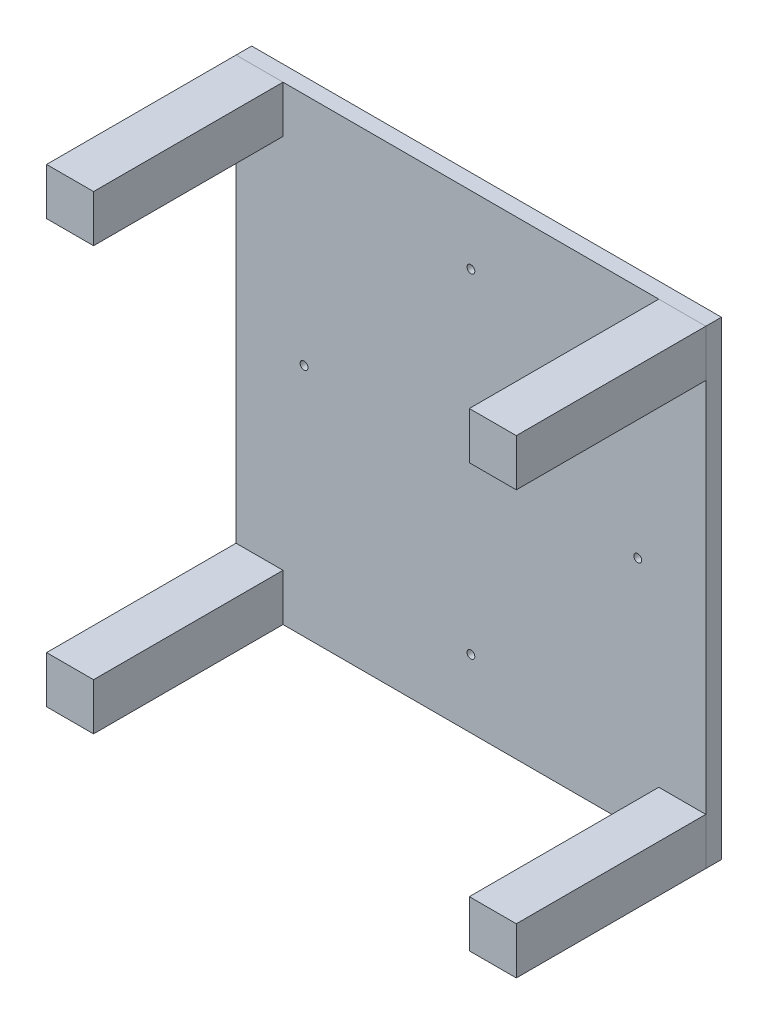
ISO-10303-21;
HEADER;
FILE_DESCRIPTION(('STEP AP214'),'2;1');
FILE_NAME('part.step','',(''),(''),'','','');
FILE_SCHEMA(('AUTOMOTIVE_DESIGN { 1 0 10303 214 1 1 1 1 }'));
ENDSEC;
DATA;
#1=APPLICATION_CONTEXT('core data for automotive mechanical design processes');
#2=APPLICATION_PROTOCOL_DEFINITION('international standard','automotive_design',2000,#1);
#3=PRODUCT_CONTEXT('',#1,'mechanical');
#4=PRODUCT('Part','Part','',(#3));
#5=PRODUCT_RELATED_PRODUCT_CATEGORY('part','',(#4));
#6=PRODUCT_DEFINITION_FORMATION('','',#4);
#7=PRODUCT_DEFINITION_CONTEXT('part definition',#1,'design');
#8=PRODUCT_DEFINITION('design','',#6,#7);
#9=PRODUCT_DEFINITION_SHAPE('','',#8);
#10=(LENGTH_UNIT() NAMED_UNIT(*) SI_UNIT(.MILLI.,.METRE.));
#11=(NAMED_UNIT(*) PLANE_ANGLE_UNIT() SI_UNIT($,.RADIAN.));
#12=(NAMED_UNIT(*) SI_UNIT($,.STERADIAN.) SOLID_ANGLE_UNIT());
#13=UNCERTAINTY_MEASURE_WITH_UNIT(LENGTH_MEASURE(1.E-05),#10,'distance_accuracy_value','');
#14=(GEOMETRIC_REPRESENTATION_CONTEXT(3) GLOBAL_UNCERTAINTY_ASSIGNED_CONTEXT((#13)) GLOBAL_UNIT_ASSIGNED_CONTEXT((#10,
#11,#12)) REPRESENTATION_CONTEXT('',''));
#15=CARTESIAN_POINT('',(0.,0.,0.));
#16=DIRECTION('',(0.,0.,1.));
#17=DIRECTION('',(1.,0.,0.));
#18=AXIS2_PLACEMENT_3D('',#15,#16,#17);
#19=CARTESIAN_POINT('',(150.,-150.,131.));
#20=DIRECTION('',(-1.,0.,0.));
#21=DIRECTION('',(0.,0.,1.));
#22=AXIS2_PLACEMENT_3D('',#19,#20,#21);
#23=PLANE('',#22);
#24=DIRECTION('',(0.,1.,0.));
#25=VECTOR('',#24,1.);
#26=CARTESIAN_POINT('',(150.,-150.,10.));
#27=LINE('',#26,#25);
#28=CARTESIAN_POINT('',(150.,-150.,10.));
#29=VERTEX_POINT('',#28);
#30=CARTESIAN_POINT('',(150.,-120.,10.));
#31=VERTEX_POINT('',#30);
#32=EDGE_CURVE('E109',#29,#31,#27,.T.);
#33=ORIENTED_EDGE('',*,*,#32,.T.);
#34=DIRECTION('',(0.,0.,-1.));
#35=VECTOR('',#34,1.);
#36=CARTESIAN_POINT('',(150.,-120.,131.));
#37=LINE('',#36,#35);
#38=CARTESIAN_POINT('',(150.,-120.,131.));
#39=VERTEX_POINT('',#38);
#40=EDGE_CURVE('E12',#39,#31,#37,.T.);
#41=ORIENTED_EDGE('',*,*,#40,.F.);
#42=DIRECTION('',(0.,1.,0.));
#43=VECTOR('',#42,1.);
#44=CARTESIAN_POINT('',(150.,-150.,131.));
#45=LINE('',#44,#43);
#46=CARTESIAN_POINT('',(150.,-150.,131.));
#47=VERTEX_POINT('',#46);
#48=EDGE_CURVE('E97',#47,#39,#45,.T.);
#49=ORIENTED_EDGE('',*,*,#48,.F.);
#50=DIRECTION('',(0.,0.,-1.));
#51=VECTOR('',#50,1.);
#52=CARTESIAN_POINT('',(150.,-150.,131.));
#53=LINE('',#52,#51);
#54=EDGE_CURVE('E105',#47,#29,#53,.T.);
#55=ORIENTED_EDGE('',*,*,#54,.T.);
#56=EDGE_LOOP('',(#33,#41,#49,#55));
#57=FACE_BOUND('',#56,.T.);
#58=ADVANCED_FACE('F46',(#57),#23,.F.);
#59=CARTESIAN_POINT('',(150.,-120.,131.));
#60=DIRECTION('',(0.,-1.,0.));
#61=DIRECTION('',(0.,0.,-1.));
#62=AXIS2_PLACEMENT_3D('',#59,#60,#61);
#63=PLANE('',#62);
#64=DIRECTION('',(-1.,0.,0.));
#65=VECTOR('',#64,1.);
#66=CARTESIAN_POINT('',(150.,-120.,10.));
#67=LINE('',#66,#65);
#68=CARTESIAN_POINT('',(120.,-120.,10.));
#69=VERTEX_POINT('',#68);
#70=EDGE_CURVE('E101',#31,#69,#67,.T.);
#71=ORIENTED_EDGE('',*,*,#70,.T.);
#72=DIRECTION('',(0.,0.,-1.));
#73=VECTOR('',#72,1.);
#74=CARTESIAN_POINT('',(120.,-120.,131.));
#75=LINE('',#74,#73);
#76=CARTESIAN_POINT('',(120.,-120.,131.));
#77=VERTEX_POINT('',#76);
#78=EDGE_CURVE('E54',#77,#69,#75,.T.);
#79=ORIENTED_EDGE('',*,*,#78,.F.);
#80=DIRECTION('',(-1.,0.,0.));
#81=VECTOR('',#80,1.);
#82=CARTESIAN_POINT('',(150.,-120.,131.));
#83=LINE('',#82,#81);
#84=EDGE_CURVE('E92',#39,#77,#83,.T.);
#85=ORIENTED_EDGE('',*,*,#84,.F.);
#86=ORIENTED_EDGE('',*,*,#40,.T.);
#87=EDGE_LOOP('',(#71,#79,#85,#86));
#88=FACE_BOUND('',#87,.T.);
#89=ADVANCED_FACE('F100',(#88),#63,.F.);
#90=CARTESIAN_POINT('',(120.,-150.,131.));
#91=DIRECTION('',(1.,0.,0.));
#92=DIRECTION('',(0.,0.,-1.));
#93=AXIS2_PLACEMENT_3D('',#90,#91,#92);
#94=PLANE('',#93);
#95=DIRECTION('',(0.,-1.,0.));
#96=VECTOR('',#95,1.);
#97=CARTESIAN_POINT('',(120.,-150.,10.));
#98=LINE('',#97,#96);
#99=CARTESIAN_POINT('',(120.,-150.,10.));
#100=VERTEX_POINT('',#99);
#101=EDGE_CURVE('E79',#69,#100,#98,.T.);
#102=ORIENTED_EDGE('',*,*,#101,.T.);
#103=DIRECTION('',(0.,0.,-1.));
#104=VECTOR('',#103,1.);
#105=CARTESIAN_POINT('',(120.,-150.,131.));
#106=LINE('',#105,#104);
#107=CARTESIAN_POINT('',(120.,-150.,131.));
#108=VERTEX_POINT('',#107);
#109=EDGE_CURVE('E102',#108,#100,#106,.T.);
#110=ORIENTED_EDGE('',*,*,#109,.F.);
#111=DIRECTION('',(0.,-1.,0.));
#112=VECTOR('',#111,1.);
#113=CARTESIAN_POINT('',(120.,-150.,131.));
#114=LINE('',#113,#112);
#115=EDGE_CURVE('E95',#77,#108,#114,.T.);
#116=ORIENTED_EDGE('',*,*,#115,.F.);
#117=ORIENTED_EDGE('',*,*,#78,.T.);
#118=EDGE_LOOP('',(#102,#110,#116,#117));
#119=FACE_BOUND('',#118,.T.);
#120=ADVANCED_FACE('F103',(#119),#94,.F.);
#121=CARTESIAN_POINT('',(150.,-150.,131.));
#122=DIRECTION('',(0.,1.,0.));
#123=DIRECTION('',(0.,0.,1.));
#124=AXIS2_PLACEMENT_3D('',#121,#122,#123);
#125=PLANE('',#124);
#126=DIRECTION('',(1.,0.,0.));
#127=VECTOR('',#126,1.);
#128=CARTESIAN_POINT('',(150.,-150.,10.));
#129=LINE('',#128,#127);
#130=EDGE_CURVE('E85',#100,#29,#129,.T.);
#131=ORIENTED_EDGE('',*,*,#130,.T.);
#132=ORIENTED_EDGE('',*,*,#54,.F.);
#133=DIRECTION('',(1.,0.,0.));
#134=VECTOR('',#133,1.);
#135=CARTESIAN_POINT('',(150.,-150.,131.));
#136=LINE('',#135,#134);
#137=EDGE_CURVE('E62',#108,#47,#136,.T.);
#138=ORIENTED_EDGE('',*,*,#137,.F.);
#139=ORIENTED_EDGE('',*,*,#109,.T.);
#140=EDGE_LOOP('',(#131,#132,#138,#139));
#141=FACE_BOUND('',#140,.T.);
#142=ADVANCED_FACE('F116',(#141),#125,.F.);
#143=CARTESIAN_POINT('',(0.,0.,131.));
#144=DIRECTION('',(0.,0.,1.));
#145=DIRECTION('',(1.,0.,0.));
#146=AXIS2_PLACEMENT_3D('',#143,#144,#145);
#147=PLANE('',#146);
#148=ORIENTED_EDGE('',*,*,#48,.T.);
#149=ORIENTED_EDGE('',*,*,#84,.T.);
#150=ORIENTED_EDGE('',*,*,#115,.T.);
#151=ORIENTED_EDGE('',*,*,#137,.T.);
#152=EDGE_LOOP('',(#148,#149,#150,#151));
#153=FACE_BOUND('',#152,.T.);
#154=ADVANCED_FACE('F93',(#153),#147,.T.);
#155=CARTESIAN_POINT('',(0.,0.,10.));
#156=DIRECTION('',(0.,0.,1.));
#157=DIRECTION('',(1.,0.,0.));
#158=AXIS2_PLACEMENT_3D('',#155,#156,#157);
#159=PLANE('',#158);
#160=ORIENTED_EDGE('',*,*,#32,.F.);
#161=ORIENTED_EDGE('',*,*,#130,.F.);
#162=ORIENTED_EDGE('',*,*,#101,.F.);
#163=ORIENTED_EDGE('',*,*,#70,.F.);
#164=EDGE_LOOP('',(#160,#161,#162,#163));
#165=FACE_BOUND('',#164,.T.);
#166=ADVANCED_FACE('F119',(#165),#159,.F.);
#167=CLOSED_SHELL('',(#58,#89,#120,#142,#154,#166));
#168=MANIFOLD_SOLID_BREP('B2',#167);
#169=CARTESIAN_POINT('',(-150.,-150.,131.));
#170=DIRECTION('',(0.,1.,0.));
#171=DIRECTION('',(0.,0.,1.));
#172=AXIS2_PLACEMENT_3D('',#169,#170,#171);
#173=PLANE('',#172);
#174=DIRECTION('',(1.,0.,0.));
#175=VECTOR('',#174,1.);
#176=CARTESIAN_POINT('',(-150.,-150.,10.));
#177=LINE('',#176,#175);
#178=CARTESIAN_POINT('',(-150.,-150.,10.));
#179=VERTEX_POINT('',#178);
#180=CARTESIAN_POINT('',(-120.,-150.,10.));
#181=VERTEX_POINT('',#180);
#182=EDGE_CURVE('E243',#179,#181,#177,.T.);
#183=ORIENTED_EDGE('',*,*,#182,.T.);
#184=DIRECTION('',(0.,0.,-1.));
#185=VECTOR('',#184,1.);
#186=CARTESIAN_POINT('',(-120.,-150.,131.));
#187=LINE('',#186,#185);
#188=CARTESIAN_POINT('',(-120.,-150.,131.));
#189=VERTEX_POINT('',#188);
#190=EDGE_CURVE('E44',#189,#181,#187,.T.);
#191=ORIENTED_EDGE('',*,*,#190,.F.);
#192=DIRECTION('',(1.,0.,0.));
#193=VECTOR('',#192,1.);
#194=CARTESIAN_POINT('',(-150.,-150.,131.));
#195=LINE('',#194,#193);
#196=CARTESIAN_POINT('',(-150.,-150.,131.));
#197=VERTEX_POINT('',#196);
#198=EDGE_CURVE('E231',#197,#189,#195,.T.);
#199=ORIENTED_EDGE('',*,*,#198,.F.);
#200=DIRECTION('',(0.,0.,-1.));
#201=VECTOR('',#200,1.);
#202=CARTESIAN_POINT('',(-150.,-150.,131.));
#203=LINE('',#202,#201);
#204=EDGE_CURVE('E239',#197,#179,#203,.T.);
#205=ORIENTED_EDGE('',*,*,#204,.T.);
#206=EDGE_LOOP('',(#183,#191,#199,#205));
#207=FACE_BOUND('',#206,.T.);
#208=ADVANCED_FACE('F180',(#207),#173,.F.);
#209=CARTESIAN_POINT('',(-120.,-150.,131.));
#210=DIRECTION('',(-1.,0.,0.));
#211=DIRECTION('',(0.,0.,1.));
#212=AXIS2_PLACEMENT_3D('',#209,#210,#211);
#213=PLANE('',#212);
#214=DIRECTION('',(0.,1.,0.));
#215=VECTOR('',#214,1.);
#216=CARTESIAN_POINT('',(-120.,-150.,10.));
#217=LINE('',#216,#215);
#218=CARTESIAN_POINT('',(-120.,-120.,10.));
#219=VERTEX_POINT('',#218);
#220=EDGE_CURVE('E235',#181,#219,#217,.T.);
#221=ORIENTED_EDGE('',*,*,#220,.T.);
#222=DIRECTION('',(0.,0.,-1.));
#223=VECTOR('',#222,1.);
#224=CARTESIAN_POINT('',(-120.,-120.,131.));
#225=LINE('',#224,#223);
#226=CARTESIAN_POINT('',(-120.,-120.,131.));
#227=VERTEX_POINT('',#226);
#228=EDGE_CURVE('E188',#227,#219,#225,.T.);
#229=ORIENTED_EDGE('',*,*,#228,.F.);
#230=DIRECTION('',(0.,1.,0.));
#231=VECTOR('',#230,1.);
#232=CARTESIAN_POINT('',(-120.,-150.,131.));
#233=LINE('',#232,#231);
#234=EDGE_CURVE('E226',#189,#227,#233,.T.);
#235=ORIENTED_EDGE('',*,*,#234,.F.);
#236=ORIENTED_EDGE('',*,*,#190,.T.);
#237=EDGE_LOOP('',(#221,#229,#235,#236));
#238=FACE_BOUND('',#237,.T.);
#239=ADVANCED_FACE('F234',(#238),#213,.F.);
#240=CARTESIAN_POINT('',(-150.,-120.,131.));
#241=DIRECTION('',(0.,-1.,0.));
#242=DIRECTION('',(0.,0.,-1.));
#243=AXIS2_PLACEMENT_3D('',#240,#241,#242);
#244=PLANE('',#243);
#245=DIRECTION('',(-1.,0.,0.));
#246=VECTOR('',#245,1.);
#247=CARTESIAN_POINT('',(-150.,-120.,10.));
#248=LINE('',#247,#246);
#249=CARTESIAN_POINT('',(-150.,-120.,10.));
#250=VERTEX_POINT('',#249);
#251=EDGE_CURVE('E213',#219,#250,#248,.T.);
#252=ORIENTED_EDGE('',*,*,#251,.T.);
#253=DIRECTION('',(0.,0.,-1.));
#254=VECTOR('',#253,1.);
#255=CARTESIAN_POINT('',(-150.,-120.,131.));
#256=LINE('',#255,#254);
#257=CARTESIAN_POINT('',(-150.,-120.,131.));
#258=VERTEX_POINT('',#257);
#259=EDGE_CURVE('E236',#258,#250,#256,.T.);
#260=ORIENTED_EDGE('',*,*,#259,.F.);
#261=DIRECTION('',(-1.,0.,0.));
#262=VECTOR('',#261,1.);
#263=CARTESIAN_POINT('',(-150.,-120.,131.));
#264=LINE('',#263,#262);
#265=EDGE_CURVE('E229',#227,#258,#264,.T.);
#266=ORIENTED_EDGE('',*,*,#265,.F.);
#267=ORIENTED_EDGE('',*,*,#228,.T.);
#268=EDGE_LOOP('',(#252,#260,#266,#267));
#269=FACE_BOUND('',#268,.T.);
#270=ADVANCED_FACE('F237',(#269),#244,.F.);
#271=CARTESIAN_POINT('',(-150.,-150.,131.));
#272=DIRECTION('',(1.,0.,0.));
#273=DIRECTION('',(0.,0.,-1.));
#274=AXIS2_PLACEMENT_3D('',#271,#272,#273);
#275=PLANE('',#274);
#276=DIRECTION('',(0.,-1.,0.));
#277=VECTOR('',#276,1.);
#278=CARTESIAN_POINT('',(-150.,-150.,10.));
#279=LINE('',#278,#277);
#280=EDGE_CURVE('E219',#250,#179,#279,.T.);
#281=ORIENTED_EDGE('',*,*,#280,.T.);
#282=ORIENTED_EDGE('',*,*,#204,.F.);
#283=DIRECTION('',(0.,-1.,0.));
#284=VECTOR('',#283,1.);
#285=CARTESIAN_POINT('',(-150.,-150.,131.));
#286=LINE('',#285,#284);
#287=EDGE_CURVE('E196',#258,#197,#286,.T.);
#288=ORIENTED_EDGE('',*,*,#287,.F.);
#289=ORIENTED_EDGE('',*,*,#259,.T.);
#290=EDGE_LOOP('',(#281,#282,#288,#289));
#291=FACE_BOUND('',#290,.T.);
#292=ADVANCED_FACE('F250',(#291),#275,.F.);
#293=CARTESIAN_POINT('',(0.,0.,131.));
#294=DIRECTION('',(0.,0.,1.));
#295=DIRECTION('',(1.,0.,0.));
#296=AXIS2_PLACEMENT_3D('',#293,#294,#295);
#297=PLANE('',#296);
#298=ORIENTED_EDGE('',*,*,#198,.T.);
#299=ORIENTED_EDGE('',*,*,#234,.T.);
#300=ORIENTED_EDGE('',*,*,#265,.T.);
#301=ORIENTED_EDGE('',*,*,#287,.T.);
#302=EDGE_LOOP('',(#298,#299,#300,#301));
#303=FACE_BOUND('',#302,.T.);
#304=ADVANCED_FACE('F227',(#303),#297,.T.);
#305=CARTESIAN_POINT('',(0.,0.,10.));
#306=DIRECTION('',(0.,0.,1.));
#307=DIRECTION('',(1.,0.,0.));
#308=AXIS2_PLACEMENT_3D('',#305,#306,#307);
#309=PLANE('',#308);
#310=ORIENTED_EDGE('',*,*,#182,.F.);
#311=ORIENTED_EDGE('',*,*,#280,.F.);
#312=ORIENTED_EDGE('',*,*,#251,.F.);
#313=ORIENTED_EDGE('',*,*,#220,.F.);
#314=EDGE_LOOP('',(#310,#311,#312,#313));
#315=FACE_BOUND('',#314,.T.);
#316=ADVANCED_FACE('F253',(#315),#309,.F.);
#317=CLOSED_SHELL('',(#208,#239,#270,#292,#304,#316));
#318=MANIFOLD_SOLID_BREP('B6',#317);
#319=CARTESIAN_POINT('',(150.,150.,131.));
#320=DIRECTION('',(0.,-1.,0.));
#321=DIRECTION('',(0.,0.,-1.));
#322=AXIS2_PLACEMENT_3D('',#319,#320,#321);
#323=PLANE('',#322);
#324=DIRECTION('',(-1.,0.,0.));
#325=VECTOR('',#324,1.);
#326=CARTESIAN_POINT('',(150.,150.,10.));
#327=LINE('',#326,#325);
#328=CARTESIAN_POINT('',(150.,150.,10.));
#329=VERTEX_POINT('',#328);
#330=CARTESIAN_POINT('',(120.,150.,10.));
#331=VERTEX_POINT('',#330);
#332=EDGE_CURVE('E377',#329,#331,#327,.T.);
#333=ORIENTED_EDGE('',*,*,#332,.T.);
#334=DIRECTION('',(0.,0.,-1.));
#335=VECTOR('',#334,1.);
#336=CARTESIAN_POINT('',(120.,150.,131.));
#337=LINE('',#336,#335);
#338=CARTESIAN_POINT('',(120.,150.,131.));
#339=VERTEX_POINT('',#338);
#340=EDGE_CURVE('E178',#339,#331,#337,.T.);
#341=ORIENTED_EDGE('',*,*,#340,.F.);
#342=DIRECTION('',(-1.,0.,0.));
#343=VECTOR('',#342,1.);
#344=CARTESIAN_POINT('',(150.,150.,131.));
#345=LINE('',#344,#343);
#346=CARTESIAN_POINT('',(150.,150.,131.));
#347=VERTEX_POINT('',#346);
#348=EDGE_CURVE('E365',#347,#339,#345,.T.);
#349=ORIENTED_EDGE('',*,*,#348,.F.);
#350=DIRECTION('',(0.,0.,-1.));
#351=VECTOR('',#350,1.);
#352=CARTESIAN_POINT('',(150.,150.,131.));
#353=LINE('',#352,#351);
#354=EDGE_CURVE('E373',#347,#329,#353,.T.);
#355=ORIENTED_EDGE('',*,*,#354,.T.);
#356=EDGE_LOOP('',(#333,#341,#349,#355));
#357=FACE_BOUND('',#356,.T.);
#358=ADVANCED_FACE('F314',(#357),#323,.F.);
#359=CARTESIAN_POINT('',(120.,150.,131.));
#360=DIRECTION('',(1.,0.,0.));
#361=DIRECTION('',(0.,0.,-1.));
#362=AXIS2_PLACEMENT_3D('',#359,#360,#361);
#363=PLANE('',#362);
#364=DIRECTION('',(0.,-1.,0.));
#365=VECTOR('',#364,1.);
#366=CARTESIAN_POINT('',(120.,150.,10.));
#367=LINE('',#366,#365);
#368=CARTESIAN_POINT('',(120.,120.,10.));
#369=VERTEX_POINT('',#368);
#370=EDGE_CURVE('E369',#331,#369,#367,.T.);
#371=ORIENTED_EDGE('',*,*,#370,.T.);
#372=DIRECTION('',(0.,0.,-1.));
#373=VECTOR('',#372,1.);
#374=CARTESIAN_POINT('',(120.,120.,131.));
#375=LINE('',#374,#373);
#376=CARTESIAN_POINT('',(120.,120.,131.));
#377=VERTEX_POINT('',#376);
#378=EDGE_CURVE('E322',#377,#369,#375,.T.);
#379=ORIENTED_EDGE('',*,*,#378,.F.);
#380=DIRECTION('',(0.,-1.,0.));
#381=VECTOR('',#380,1.);
#382=CARTESIAN_POINT('',(120.,150.,131.));
#383=LINE('',#382,#381);
#384=EDGE_CURVE('E360',#339,#377,#383,.T.);
#385=ORIENTED_EDGE('',*,*,#384,.F.);
#386=ORIENTED_EDGE('',*,*,#340,.T.);
#387=EDGE_LOOP('',(#371,#379,#385,#386));
#388=FACE_BOUND('',#387,.T.);
#389=ADVANCED_FACE('F368',(#388),#363,.F.);
#390=CARTESIAN_POINT('',(150.,120.,131.));
#391=DIRECTION('',(0.,1.,0.));
#392=DIRECTION('',(0.,0.,1.));
#393=AXIS2_PLACEMENT_3D('',#390,#391,#392);
#394=PLANE('',#393);
#395=DIRECTION('',(1.,0.,0.));
#396=VECTOR('',#395,1.);
#397=CARTESIAN_POINT('',(150.,120.,10.));
#398=LINE('',#397,#396);
#399=CARTESIAN_POINT('',(150.,120.,10.));
#400=VERTEX_POINT('',#399);
#401=EDGE_CURVE('E347',#369,#400,#398,.T.);
#402=ORIENTED_EDGE('',*,*,#401,.T.);
#403=DIRECTION('',(0.,0.,-1.));
#404=VECTOR('',#403,1.);
#405=CARTESIAN_POINT('',(150.,120.,131.));
#406=LINE('',#405,#404);
#407=CARTESIAN_POINT('',(150.,120.,131.));
#408=VERTEX_POINT('',#407);
#409=EDGE_CURVE('E370',#408,#400,#406,.T.);
#410=ORIENTED_EDGE('',*,*,#409,.F.);
#411=DIRECTION('',(1.,0.,0.));
#412=VECTOR('',#411,1.);
#413=CARTESIAN_POINT('',(150.,120.,131.));
#414=LINE('',#413,#412);
#415=EDGE_CURVE('E363',#377,#408,#414,.T.);
#416=ORIENTED_EDGE('',*,*,#415,.F.);
#417=ORIENTED_EDGE('',*,*,#378,.T.);
#418=EDGE_LOOP('',(#402,#410,#416,#417));
#419=FACE_BOUND('',#418,.T.);
#420=ADVANCED_FACE('F371',(#419),#394,.F.);
#421=CARTESIAN_POINT('',(150.,150.,131.));
#422=DIRECTION('',(-1.,0.,0.));
#423=DIRECTION('',(0.,0.,1.));
#424=AXIS2_PLACEMENT_3D('',#421,#422,#423);
#425=PLANE('',#424);
#426=DIRECTION('',(0.,1.,0.));
#427=VECTOR('',#426,1.);
#428=CARTESIAN_POINT('',(150.,150.,10.));
#429=LINE('',#428,#427);
#430=EDGE_CURVE('E353',#400,#329,#429,.T.);
#431=ORIENTED_EDGE('',*,*,#430,.T.);
#432=ORIENTED_EDGE('',*,*,#354,.F.);
#433=DIRECTION('',(0.,1.,0.));
#434=VECTOR('',#433,1.);
#435=CARTESIAN_POINT('',(150.,150.,131.));
#436=LINE('',#435,#434);
#437=EDGE_CURVE('E330',#408,#347,#436,.T.);
#438=ORIENTED_EDGE('',*,*,#437,.F.);
#439=ORIENTED_EDGE('',*,*,#409,.T.);
#440=EDGE_LOOP('',(#431,#432,#438,#439));
#441=FACE_BOUND('',#440,.T.);
#442=ADVANCED_FACE('F384',(#441),#425,.F.);
#443=CARTESIAN_POINT('',(0.,0.,131.));
#444=DIRECTION('',(0.,0.,1.));
#445=DIRECTION('',(1.,0.,0.));
#446=AXIS2_PLACEMENT_3D('',#443,#444,#445);
#447=PLANE('',#446);
#448=ORIENTED_EDGE('',*,*,#348,.T.);
#449=ORIENTED_EDGE('',*,*,#384,.T.);
#450=ORIENTED_EDGE('',*,*,#415,.T.);
#451=ORIENTED_EDGE('',*,*,#437,.T.);
#452=EDGE_LOOP('',(#448,#449,#450,#451));
#453=FACE_BOUND('',#452,.T.);
#454=ADVANCED_FACE('F361',(#453),#447,.T.);
#455=CARTESIAN_POINT('',(0.,0.,10.));
#456=DIRECTION('',(0.,0.,1.));
#457=DIRECTION('',(1.,0.,0.));
#458=AXIS2_PLACEMENT_3D('',#455,#456,#457);
#459=PLANE('',#458);
#460=ORIENTED_EDGE('',*,*,#332,.F.);
#461=ORIENTED_EDGE('',*,*,#430,.F.);
#462=ORIENTED_EDGE('',*,*,#401,.F.);
#463=ORIENTED_EDGE('',*,*,#370,.F.);
#464=EDGE_LOOP('',(#460,#461,#462,#463));
#465=FACE_BOUND('',#464,.T.);
#466=ADVANCED_FACE('F387',(#465),#459,.F.);
#467=CLOSED_SHELL('',(#358,#389,#420,#442,#454,#466));
#468=MANIFOLD_SOLID_BREP('B38',#467);
#469=CARTESIAN_POINT('',(-150.,150.,131.));
#470=DIRECTION('',(1.,0.,0.));
#471=DIRECTION('',(0.,0.,-1.));
#472=AXIS2_PLACEMENT_3D('',#469,#470,#471);
#473=PLANE('',#472);
#474=DIRECTION('',(0.,-1.,0.));
#475=VECTOR('',#474,1.);
#476=CARTESIAN_POINT('',(-150.,150.,10.));
#477=LINE('',#476,#475);
#478=CARTESIAN_POINT('',(-150.,150.,10.));
#479=VERTEX_POINT('',#478);
#480=CARTESIAN_POINT('',(-150.,120.,10.));
#481=VERTEX_POINT('',#480);
#482=EDGE_CURVE('E510',#479,#481,#477,.T.);
#483=ORIENTED_EDGE('',*,*,#482,.T.);
#484=DIRECTION('',(0.,0.,-1.));
#485=VECTOR('',#484,1.);
#486=CARTESIAN_POINT('',(-150.,120.,131.));
#487=LINE('',#486,#485);
#488=CARTESIAN_POINT('',(-150.,120.,131.));
#489=VERTEX_POINT('',#488);
#490=EDGE_CURVE('E312',#489,#481,#487,.T.);
#491=ORIENTED_EDGE('',*,*,#490,.F.);
#492=DIRECTION('',(0.,-1.,0.));
#493=VECTOR('',#492,1.);
#494=CARTESIAN_POINT('',(-150.,150.,131.));
#495=LINE('',#494,#493);
#496=CARTESIAN_POINT('',(-150.,150.,131.));
#497=VERTEX_POINT('',#496);
#498=EDGE_CURVE('E498',#497,#489,#495,.T.);
#499=ORIENTED_EDGE('',*,*,#498,.F.);
#500=DIRECTION('',(0.,0.,-1.));
#501=VECTOR('',#500,1.);
#502=CARTESIAN_POINT('',(-150.,150.,131.));
#503=LINE('',#502,#501);
#504=EDGE_CURVE('E506',#497,#479,#503,.T.);
#505=ORIENTED_EDGE('',*,*,#504,.T.);
#506=EDGE_LOOP('',(#483,#491,#499,#505));
#507=FACE_BOUND('',#506,.T.);
#508=ADVANCED_FACE('F447',(#507),#473,.F.);
#509=CARTESIAN_POINT('',(-150.,120.,131.));
#510=DIRECTION('',(0.,1.,0.));
#511=DIRECTION('',(0.,0.,1.));
#512=AXIS2_PLACEMENT_3D('',#509,#510,#511);
#513=PLANE('',#512);
#514=DIRECTION('',(1.,0.,0.));
#515=VECTOR('',#514,1.);
#516=CARTESIAN_POINT('',(-150.,120.,10.));
#517=LINE('',#516,#515);
#518=CARTESIAN_POINT('',(-120.,120.,10.));
#519=VERTEX_POINT('',#518);
#520=EDGE_CURVE('E502',#481,#519,#517,.T.);
#521=ORIENTED_EDGE('',*,*,#520,.T.);
#522=DIRECTION('',(0.,0.,-1.));
#523=VECTOR('',#522,1.);
#524=CARTESIAN_POINT('',(-120.,120.,131.));
#525=LINE('',#524,#523);
#526=CARTESIAN_POINT('',(-120.,120.,131.));
#527=VERTEX_POINT('',#526);
#528=EDGE_CURVE('E455',#527,#519,#525,.T.);
#529=ORIENTED_EDGE('',*,*,#528,.F.);
#530=DIRECTION('',(1.,0.,0.));
#531=VECTOR('',#530,1.);
#532=CARTESIAN_POINT('',(-150.,120.,131.));
#533=LINE('',#532,#531);
#534=EDGE_CURVE('E493',#489,#527,#533,.T.);
#535=ORIENTED_EDGE('',*,*,#534,.F.);
#536=ORIENTED_EDGE('',*,*,#490,.T.);
#537=EDGE_LOOP('',(#521,#529,#535,#536));
#538=FACE_BOUND('',#537,.T.);
#539=ADVANCED_FACE('F501',(#538),#513,.F.);
#540=CARTESIAN_POINT('',(-120.,150.,131.));
#541=DIRECTION('',(-1.,0.,0.));
#542=DIRECTION('',(0.,0.,1.));
#543=AXIS2_PLACEMENT_3D('',#540,#541,#542);
#544=PLANE('',#543);
#545=DIRECTION('',(0.,1.,0.));
#546=VECTOR('',#545,1.);
#547=CARTESIAN_POINT('',(-120.,150.,10.));
#548=LINE('',#547,#546);
#549=CARTESIAN_POINT('',(-120.,150.,10.));
#550=VERTEX_POINT('',#549);
#551=EDGE_CURVE('E480',#519,#550,#548,.T.);
#552=ORIENTED_EDGE('',*,*,#551,.T.);
#553=DIRECTION('',(0.,0.,-1.));
#554=VECTOR('',#553,1.);
#555=CARTESIAN_POINT('',(-120.,150.,131.));
#556=LINE('',#555,#554);
#557=CARTESIAN_POINT('',(-120.,150.,131.));
#558=VERTEX_POINT('',#557);
#559=EDGE_CURVE('E503',#558,#550,#556,.T.);
#560=ORIENTED_EDGE('',*,*,#559,.F.);
#561=DIRECTION('',(0.,1.,0.));
#562=VECTOR('',#561,1.);
#563=CARTESIAN_POINT('',(-120.,150.,131.));
#564=LINE('',#563,#562);
#565=EDGE_CURVE('E496',#527,#558,#564,.T.);
#566=ORIENTED_EDGE('',*,*,#565,.F.);
#567=ORIENTED_EDGE('',*,*,#528,.T.);
#568=EDGE_LOOP('',(#552,#560,#566,#567));
#569=FACE_BOUND('',#568,.T.);
#570=ADVANCED_FACE('F504',(#569),#544,.F.);
#571=CARTESIAN_POINT('',(-150.,150.,131.));
#572=DIRECTION('',(0.,-1.,0.));
#573=DIRECTION('',(0.,0.,-1.));
#574=AXIS2_PLACEMENT_3D('',#571,#572,#573);
#575=PLANE('',#574);
#576=DIRECTION('',(-1.,0.,0.));
#577=VECTOR('',#576,1.);
#578=CARTESIAN_POINT('',(-150.,150.,10.));
#579=LINE('',#578,#577);
#580=EDGE_CURVE('E486',#550,#479,#579,.T.);
#581=ORIENTED_EDGE('',*,*,#580,.T.);
#582=ORIENTED_EDGE('',*,*,#504,.F.);
#583=DIRECTION('',(-1.,0.,0.));
#584=VECTOR('',#583,1.);
#585=CARTESIAN_POINT('',(-150.,150.,131.));
#586=LINE('',#585,#584);
#587=EDGE_CURVE('E463',#558,#497,#586,.T.);
#588=ORIENTED_EDGE('',*,*,#587,.F.);
#589=ORIENTED_EDGE('',*,*,#559,.T.);
#590=EDGE_LOOP('',(#581,#582,#588,#589));
#591=FACE_BOUND('',#590,.T.);
#592=ADVANCED_FACE('F517',(#591),#575,.F.);
#593=CARTESIAN_POINT('',(0.,0.,131.));
#594=DIRECTION('',(0.,0.,1.));
#595=DIRECTION('',(1.,0.,0.));
#596=AXIS2_PLACEMENT_3D('',#593,#594,#595);
#597=PLANE('',#596);
#598=ORIENTED_EDGE('',*,*,#498,.T.);
#599=ORIENTED_EDGE('',*,*,#534,.T.);
#600=ORIENTED_EDGE('',*,*,#565,.T.);
#601=ORIENTED_EDGE('',*,*,#587,.T.);
#602=EDGE_LOOP('',(#598,#599,#600,#601));
#603=FACE_BOUND('',#602,.T.);
#604=ADVANCED_FACE('F494',(#603),#597,.T.);
#605=CARTESIAN_POINT('',(0.,0.,10.));
#606=DIRECTION('',(0.,0.,1.));
#607=DIRECTION('',(1.,0.,0.));
#608=AXIS2_PLACEMENT_3D('',#605,#606,#607);
#609=PLANE('',#608);
#610=ORIENTED_EDGE('',*,*,#482,.F.);
#611=ORIENTED_EDGE('',*,*,#580,.F.);
#612=ORIENTED_EDGE('',*,*,#551,.F.);
#613=ORIENTED_EDGE('',*,*,#520,.F.);
#614=EDGE_LOOP('',(#610,#611,#612,#613));
#615=FACE_BOUND('',#614,.T.);
#616=ADVANCED_FACE('F520',(#615),#609,.F.);
#617=CLOSED_SHELL('',(#508,#539,#570,#592,#604,#616));
#618=MANIFOLD_SOLID_BREP('B172',#617);
#619=CARTESIAN_POINT('',(0.,0.,10.));
#620=DIRECTION('',(0.,0.,1.));
#621=DIRECTION('',(1.,0.,0.));
#622=AXIS2_PLACEMENT_3D('',#619,#620,#621);
#623=PLANE('',#622);
#624=CARTESIAN_POINT('',(106.56267268115,1.10230696144264E-12,10.));
#625=DIRECTION('',(0.,0.,1.));
#626=DIRECTION('',(1.,0.,0.));
#627=AXIS2_PLACEMENT_3D('',#624,#625,#626);
#628=CIRCLE('',#627,2.50000000000001);
#629=CARTESIAN_POINT('',(109.06267268115,1.10230696144264E-12,10.));
#630=VERTEX_POINT('',#629);
#631=EDGE_CURVE('E659',#630,#630,#628,.T.);
#632=ORIENTED_EDGE('',*,*,#631,.F.);
#633=EDGE_LOOP('',(#632));
#634=FACE_BOUND('',#633,.T.);
#635=CARTESIAN_POINT('',(7.47592613118922E-13,-106.56267268115,10.));
#636=DIRECTION('',(0.,0.,1.));
#637=DIRECTION('',(1.,0.,0.));
#638=AXIS2_PLACEMENT_3D('',#635,#636,#637);
#639=CIRCLE('',#638,2.5);
#640=CARTESIAN_POINT('',(2.50000000000075,-106.56267268115,10.));
#641=VERTEX_POINT('',#640);
#642=EDGE_CURVE('E638',#641,#641,#639,.T.);
#643=ORIENTED_EDGE('',*,*,#642,.F.);
#644=EDGE_LOOP('',(#643));
#645=FACE_BOUND('',#644,.T.);
#646=DIRECTION('',(0.,1.,0.));
#647=VECTOR('',#646,1.);
#648=CARTESIAN_POINT('',(150.,150.,10.));
#649=LINE('',#648,#647);
#650=CARTESIAN_POINT('',(150.,-150.,10.));
#651=VERTEX_POINT('',#650);
#652=CARTESIAN_POINT('',(150.,150.,10.));
#653=VERTEX_POINT('',#652);
#654=EDGE_CURVE('E623',#651,#653,#649,.T.);
#655=ORIENTED_EDGE('',*,*,#654,.T.);
#656=DIRECTION('',(-1.,0.,0.));
#657=VECTOR('',#656,1.);
#658=CARTESIAN_POINT('',(-150.,150.,10.));
#659=LINE('',#658,#657);
#660=CARTESIAN_POINT('',(-150.,150.,10.));
#661=VERTEX_POINT('',#660);
#662=EDGE_CURVE('E618',#653,#661,#659,.T.);
#663=ORIENTED_EDGE('',*,*,#662,.T.);
#664=DIRECTION('',(0.,-1.,0.));
#665=VECTOR('',#664,1.);
#666=CARTESIAN_POINT('',(-150.,150.,10.));
#667=LINE('',#666,#665);
#668=CARTESIAN_POINT('',(-150.,-150.,10.));
#669=VERTEX_POINT('',#668);
#670=EDGE_CURVE('E621',#661,#669,#667,.T.);
#671=ORIENTED_EDGE('',*,*,#670,.T.);
#672=DIRECTION('',(1.,0.,0.));
#673=VECTOR('',#672,1.);
#674=CARTESIAN_POINT('',(-150.,-150.,10.));
#675=LINE('',#674,#673);
#676=EDGE_CURVE('E588',#669,#651,#675,.T.);
#677=ORIENTED_EDGE('',*,*,#676,.T.);
#678=EDGE_LOOP('',(#655,#663,#671,#677));
#679=FACE_BOUND('',#678,.T.);
#680=CARTESIAN_POINT('',(-106.56267268115,-3.72061583083484E-13,10.));
#681=DIRECTION('',(0.,0.,1.));
#682=DIRECTION('',(1.,0.,0.));
#683=AXIS2_PLACEMENT_3D('',#680,#681,#682);
#684=CIRCLE('',#683,2.50000000000001);
#685=CARTESIAN_POINT('',(-104.06267268115,-3.72061583083484E-13,10.));
#686=VERTEX_POINT('',#685);
#687=EDGE_CURVE('E653',#686,#686,#684,.T.);
#688=ORIENTED_EDGE('',*,*,#687,.F.);
#689=EDGE_LOOP('',(#688));
#690=FACE_BOUND('',#689,.T.);
#691=CARTESIAN_POINT('',(0.,106.56267268115,10.));
#692=DIRECTION('',(0.,0.,1.));
#693=DIRECTION('',(1.,0.,0.));
#694=AXIS2_PLACEMENT_3D('',#691,#692,#693);
#695=CIRCLE('',#694,2.5);
#696=CARTESIAN_POINT('',(2.5,106.56267268115,10.));
#697=VERTEX_POINT('',#696);
#698=EDGE_CURVE('E665',#697,#697,#695,.T.);
#699=ORIENTED_EDGE('',*,*,#698,.F.);
#700=EDGE_LOOP('',(#699));
#701=FACE_BOUND('',#700,.T.);
#702=ADVANCED_FACE('F571',(#634,#645,#679,#690,#701),#623,.T.);
#703=CARTESIAN_POINT('',(0.,0.,0.));
#704=DIRECTION('',(0.,0.,1.));
#705=DIRECTION('',(1.,0.,0.));
#706=AXIS2_PLACEMENT_3D('',#703,#704,#705);
#707=PLANE('',#706);
#708=DIRECTION('',(0.,1.,0.));
#709=VECTOR('',#708,1.);
#710=CARTESIAN_POINT('',(150.,150.,0.));
#711=LINE('',#710,#709);
#712=CARTESIAN_POINT('',(150.,-150.,0.));
#713=VERTEX_POINT('',#712);
#714=CARTESIAN_POINT('',(150.,150.,0.));
#715=VERTEX_POINT('',#714);
#716=EDGE_CURVE('E635',#713,#715,#711,.T.);
#717=ORIENTED_EDGE('',*,*,#716,.F.);
#718=DIRECTION('',(1.,0.,0.));
#719=VECTOR('',#718,1.);
#720=CARTESIAN_POINT('',(-150.,-150.,0.));
#721=LINE('',#720,#719);
#722=CARTESIAN_POINT('',(-150.,-150.,0.));
#723=VERTEX_POINT('',#722);
#724=EDGE_CURVE('E611',#723,#713,#721,.T.);
#725=ORIENTED_EDGE('',*,*,#724,.F.);
#726=DIRECTION('',(0.,-1.,0.));
#727=VECTOR('',#726,1.);
#728=CARTESIAN_POINT('',(-150.,150.,0.));
#729=LINE('',#728,#727);
#730=CARTESIAN_POINT('',(-150.,150.,0.));
#731=VERTEX_POINT('',#730);
#732=EDGE_CURVE('E605',#731,#723,#729,.T.);
#733=ORIENTED_EDGE('',*,*,#732,.F.);
#734=DIRECTION('',(-1.,0.,0.));
#735=VECTOR('',#734,1.);
#736=CARTESIAN_POINT('',(-150.,150.,0.));
#737=LINE('',#736,#735);
#738=EDGE_CURVE('E627',#715,#731,#737,.T.);
#739=ORIENTED_EDGE('',*,*,#738,.F.);
#740=EDGE_LOOP('',(#717,#725,#733,#739));
#741=FACE_BOUND('',#740,.T.);
#742=CARTESIAN_POINT('',(7.47592613118922E-13,-106.56267268115,0.));
#743=DIRECTION('',(0.,0.,1.));
#744=DIRECTION('',(1.,0.,0.));
#745=AXIS2_PLACEMENT_3D('',#742,#743,#744);
#746=CIRCLE('',#745,2.5);
#747=CARTESIAN_POINT('',(2.50000000000075,-106.56267268115,0.));
#748=VERTEX_POINT('',#747);
#749=EDGE_CURVE('E650',#748,#748,#746,.T.);
#750=ORIENTED_EDGE('',*,*,#749,.T.);
#751=EDGE_LOOP('',(#750));
#752=FACE_BOUND('',#751,.T.);
#753=CARTESIAN_POINT('',(-106.56267268115,-3.72061583083484E-13,0.));
#754=DIRECTION('',(0.,0.,1.));
#755=DIRECTION('',(1.,0.,0.));
#756=AXIS2_PLACEMENT_3D('',#753,#754,#755);
#757=CIRCLE('',#756,2.50000000000001);
#758=CARTESIAN_POINT('',(-104.06267268115,-3.72061583083484E-13,0.));
#759=VERTEX_POINT('',#758);
#760=EDGE_CURVE('E656',#759,#759,#757,.T.);
#761=ORIENTED_EDGE('',*,*,#760,.T.);
#762=EDGE_LOOP('',(#761));
#763=FACE_BOUND('',#762,.T.);
#764=CARTESIAN_POINT('',(106.56267268115,1.10230696144264E-12,0.));
#765=DIRECTION('',(0.,0.,1.));
#766=DIRECTION('',(1.,0.,0.));
#767=AXIS2_PLACEMENT_3D('',#764,#765,#766);
#768=CIRCLE('',#767,2.50000000000001);
#769=CARTESIAN_POINT('',(109.06267268115,1.10230696144264E-12,0.));
#770=VERTEX_POINT('',#769);
#771=EDGE_CURVE('E662',#770,#770,#768,.T.);
#772=ORIENTED_EDGE('',*,*,#771,.T.);
#773=EDGE_LOOP('',(#772));
#774=FACE_BOUND('',#773,.T.);
#775=CARTESIAN_POINT('',(0.,106.56267268115,0.));
#776=DIRECTION('',(0.,0.,1.));
#777=DIRECTION('',(1.,0.,0.));
#778=AXIS2_PLACEMENT_3D('',#775,#776,#777);
#779=CIRCLE('',#778,2.5);
#780=CARTESIAN_POINT('',(2.5,106.56267268115,0.));
#781=VERTEX_POINT('',#780);
#782=EDGE_CURVE('E668',#781,#781,#779,.T.);
#783=ORIENTED_EDGE('',*,*,#782,.T.);
#784=EDGE_LOOP('',(#783));
#785=FACE_BOUND('',#784,.T.);
#786=ADVANCED_FACE('F646',(#741,#752,#763,#774,#785),#707,.F.);
#787=CARTESIAN_POINT('',(150.,150.,10.));
#788=DIRECTION('',(-1.,0.,0.));
#789=DIRECTION('',(0.,0.,1.));
#790=AXIS2_PLACEMENT_3D('',#787,#788,#789);
#791=PLANE('',#790);
#792=ORIENTED_EDGE('',*,*,#716,.T.);
#793=DIRECTION('',(0.,0.,-1.));
#794=VECTOR('',#793,1.);
#795=CARTESIAN_POINT('',(150.,150.,10.));
#796=LINE('',#795,#794);
#797=EDGE_CURVE('E445',#653,#715,#796,.T.);
#798=ORIENTED_EDGE('',*,*,#797,.F.);
#799=ORIENTED_EDGE('',*,*,#654,.F.);
#800=DIRECTION('',(0.,0.,-1.));
#801=VECTOR('',#800,1.);
#802=CARTESIAN_POINT('',(150.,-150.,10.));
#803=LINE('',#802,#801);
#804=EDGE_CURVE('E631',#651,#713,#803,.T.);
#805=ORIENTED_EDGE('',*,*,#804,.T.);
#806=EDGE_LOOP('',(#792,#798,#799,#805));
#807=FACE_BOUND('',#806,.T.);
#808=ADVANCED_FACE('F573',(#807),#791,.F.);
#809=CARTESIAN_POINT('',(-150.,150.,10.));
#810=DIRECTION('',(0.,-1.,0.));
#811=DIRECTION('',(0.,0.,-1.));
#812=AXIS2_PLACEMENT_3D('',#809,#810,#811);
#813=PLANE('',#812);
#814=ORIENTED_EDGE('',*,*,#738,.T.);
#815=DIRECTION('',(0.,0.,-1.));
#816=VECTOR('',#815,1.);
#817=CARTESIAN_POINT('',(-150.,150.,10.));
#818=LINE('',#817,#816);
#819=EDGE_CURVE('E580',#661,#731,#818,.T.);
#820=ORIENTED_EDGE('',*,*,#819,.F.);
#821=ORIENTED_EDGE('',*,*,#662,.F.);
#822=ORIENTED_EDGE('',*,*,#797,.T.);
#823=EDGE_LOOP('',(#814,#820,#821,#822));
#824=FACE_BOUND('',#823,.T.);
#825=ADVANCED_FACE('F626',(#824),#813,.F.);
#826=CARTESIAN_POINT('',(-150.,150.,10.));
#827=DIRECTION('',(1.,0.,0.));
#828=DIRECTION('',(0.,1.,0.));
#829=AXIS2_PLACEMENT_3D('',#826,#827,#828);
#830=PLANE('',#829);
#831=ORIENTED_EDGE('',*,*,#732,.T.);
#832=DIRECTION('',(0.,0.,-1.));
#833=VECTOR('',#832,1.);
#834=CARTESIAN_POINT('',(-150.,-150.,10.));
#835=LINE('',#834,#833);
#836=EDGE_CURVE('E628',#669,#723,#835,.T.);
#837=ORIENTED_EDGE('',*,*,#836,.F.);
#838=ORIENTED_EDGE('',*,*,#670,.F.);
#839=ORIENTED_EDGE('',*,*,#819,.T.);
#840=EDGE_LOOP('',(#831,#837,#838,#839));
#841=FACE_BOUND('',#840,.T.);
#842=ADVANCED_FACE('F629',(#841),#830,.F.);
#843=CARTESIAN_POINT('',(-150.,-150.,10.));
#844=DIRECTION('',(0.,1.,0.));
#845=DIRECTION('',(0.,0.,1.));
#846=AXIS2_PLACEMENT_3D('',#843,#844,#845);
#847=PLANE('',#846);
#848=ORIENTED_EDGE('',*,*,#724,.T.);
#849=ORIENTED_EDGE('',*,*,#804,.F.);
#850=ORIENTED_EDGE('',*,*,#676,.F.);
#851=ORIENTED_EDGE('',*,*,#836,.T.);
#852=EDGE_LOOP('',(#848,#849,#850,#851));
#853=FACE_BOUND('',#852,.T.);
#854=ADVANCED_FACE('F643',(#853),#847,.F.);
#855=CARTESIAN_POINT('',(7.47592613118922E-13,-106.56267268115,10.));
#856=DIRECTION('',(0.,0.,-1.));
#857=DIRECTION('',(-1.,0.,0.));
#858=AXIS2_PLACEMENT_3D('',#855,#856,#857);
#859=CYLINDRICAL_SURFACE('',#858,2.5);
#860=ORIENTED_EDGE('',*,*,#642,.T.);
#861=EDGE_LOOP('',(#860));
#862=FACE_BOUND('',#861,.T.);
#863=ORIENTED_EDGE('',*,*,#749,.F.);
#864=EDGE_LOOP('',(#863));
#865=FACE_BOUND('',#864,.T.);
#866=ADVANCED_FACE('F687',(#862,#865),#859,.F.);
#867=CARTESIAN_POINT('',(-106.56267268115,-3.72061583083484E-13,10.));
#868=DIRECTION('',(0.,0.,-1.));
#869=DIRECTION('',(-1.,0.,0.));
#870=AXIS2_PLACEMENT_3D('',#867,#868,#869);
#871=CYLINDRICAL_SURFACE('',#870,2.50000000000001);
#872=ORIENTED_EDGE('',*,*,#687,.T.);
#873=EDGE_LOOP('',(#872));
#874=FACE_BOUND('',#873,.T.);
#875=ORIENTED_EDGE('',*,*,#760,.F.);
#876=EDGE_LOOP('',(#875));
#877=FACE_BOUND('',#876,.T.);
#878=ADVANCED_FACE('F733',(#874,#877),#871,.F.);
#879=CARTESIAN_POINT('',(106.56267268115,1.10230696144264E-12,10.));
#880=DIRECTION('',(0.,0.,-1.));
#881=DIRECTION('',(-1.,0.,0.));
#882=AXIS2_PLACEMENT_3D('',#879,#880,#881);
#883=CYLINDRICAL_SURFACE('',#882,2.50000000000001);
#884=ORIENTED_EDGE('',*,*,#631,.T.);
#885=EDGE_LOOP('',(#884));
#886=FACE_BOUND('',#885,.T.);
#887=ORIENTED_EDGE('',*,*,#771,.F.);
#888=EDGE_LOOP('',(#887));
#889=FACE_BOUND('',#888,.T.);
#890=ADVANCED_FACE('F741',(#886,#889),#883,.F.);
#891=CARTESIAN_POINT('',(0.,106.56267268115,10.));
#892=DIRECTION('',(0.,0.,-1.));
#893=DIRECTION('',(-1.,0.,0.));
#894=AXIS2_PLACEMENT_3D('',#891,#892,#893);
#895=CYLINDRICAL_SURFACE('',#894,2.5);
#896=ORIENTED_EDGE('',*,*,#698,.T.);
#897=EDGE_LOOP('',(#896));
#898=FACE_BOUND('',#897,.T.);
#899=ORIENTED_EDGE('',*,*,#782,.F.);
#900=EDGE_LOOP('',(#899));
#901=FACE_BOUND('',#900,.T.);
#902=ADVANCED_FACE('F674',(#898,#901),#895,.F.);
#903=CLOSED_SHELL('',(#702,#786,#808,#825,#842,#854,#866,#878,#890,#902));
#904=MANIFOLD_SOLID_BREP('B306',#903);
#905=ADVANCED_BREP_SHAPE_REPRESENTATION('',(#18,#168,#318,#468,#618,#904),#14);
#906=SHAPE_DEFINITION_REPRESENTATION(#9,#905);
ENDSEC;
END-ISO-10303-21;
